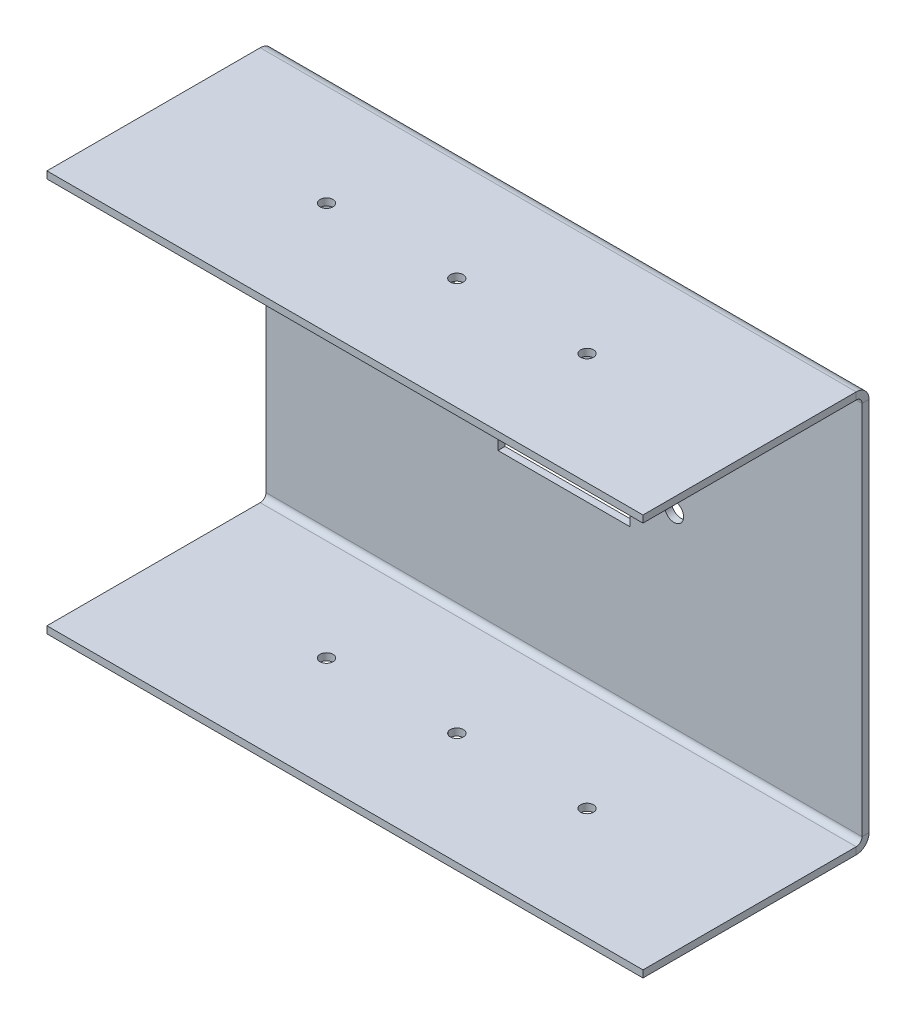
ISO-10303-21;
HEADER;
FILE_DESCRIPTION(('STEP AP214'),'2;1');
FILE_NAME('part.step','',(''),(''),'','','');
FILE_SCHEMA(('AUTOMOTIVE_DESIGN { 1 0 10303 214 1 1 1 1 }'));
ENDSEC;
DATA;
#1=APPLICATION_CONTEXT('core data for automotive mechanical design processes');
#2=APPLICATION_PROTOCOL_DEFINITION('international standard','automotive_design',2000,#1);
#3=PRODUCT_CONTEXT('',#1,'mechanical');
#4=PRODUCT('Part','Part','',(#3));
#5=PRODUCT_RELATED_PRODUCT_CATEGORY('part','',(#4));
#6=PRODUCT_DEFINITION_FORMATION('','',#4);
#7=PRODUCT_DEFINITION_CONTEXT('part definition',#1,'design');
#8=PRODUCT_DEFINITION('design','',#6,#7);
#9=PRODUCT_DEFINITION_SHAPE('','',#8);
#10=(LENGTH_UNIT() NAMED_UNIT(*) SI_UNIT(.MILLI.,.METRE.));
#11=(NAMED_UNIT(*) PLANE_ANGLE_UNIT() SI_UNIT($,.RADIAN.));
#12=(NAMED_UNIT(*) SI_UNIT($,.STERADIAN.) SOLID_ANGLE_UNIT());
#13=UNCERTAINTY_MEASURE_WITH_UNIT(LENGTH_MEASURE(1.E-05),#10,'distance_accuracy_value','');
#14=(GEOMETRIC_REPRESENTATION_CONTEXT(3) GLOBAL_UNCERTAINTY_ASSIGNED_CONTEXT((#13)) GLOBAL_UNIT_ASSIGNED_CONTEXT((#10,
#11,#12)) REPRESENTATION_CONTEXT('',''));
#15=CARTESIAN_POINT('',(0.,0.,0.));
#16=DIRECTION('',(0.,0.,1.));
#17=DIRECTION('',(1.,0.,0.));
#18=AXIS2_PLACEMENT_3D('',#15,#16,#17);
#19=CARTESIAN_POINT('',(0.,138.125592566536,137.014207433465));
#20=DIRECTION('',(0.,0.,1.));
#21=DIRECTION('',(0.,-1.,0.));
#22=AXIS2_PLACEMENT_3D('',#19,#20,#21);
#23=PLANE('',#22);
#24=DIRECTION('',(-1.,0.,0.));
#25=VECTOR('',#24,1.);
#26=CARTESIAN_POINT('',(52.69,55.9405925665379,137.014207433464));
#27=LINE('',#26,#25);
#28=CARTESIAN_POINT('',(82.69,55.9405925665358,137.014207433464));
#29=VERTEX_POINT('',#28);
#30=CARTESIAN_POINT('',(52.69,55.9405925665379,137.014207433464));
#31=VERTEX_POINT('',#30);
#32=EDGE_CURVE('E327',#29,#31,#27,.T.);
#33=ORIENTED_EDGE('',*,*,#32,.T.);
#34=DIRECTION('',(0.,-1.,0.));
#35=VECTOR('',#34,1.);
#36=CARTESIAN_POINT('',(52.69,55.9405925665379,137.014207433464));
#37=LINE('',#36,#35);
#38=CARTESIAN_POINT('',(52.69,35.9405925665358,137.014207433464));
#39=VERTEX_POINT('',#38);
#40=EDGE_CURVE('E317',#31,#39,#37,.T.);
#41=ORIENTED_EDGE('',*,*,#40,.T.);
#42=DIRECTION('',(1.,0.,0.));
#43=VECTOR('',#42,1.);
#44=CARTESIAN_POINT('',(52.69,35.9405925665358,137.014207433464));
#45=LINE('',#44,#43);
#46=CARTESIAN_POINT('',(82.69,35.9405925665358,137.014207433464));
#47=VERTEX_POINT('',#46);
#48=EDGE_CURVE('E320',#39,#47,#45,.T.);
#49=ORIENTED_EDGE('',*,*,#48,.T.);
#50=DIRECTION('',(0.,1.,0.));
#51=VECTOR('',#50,1.);
#52=CARTESIAN_POINT('',(82.69,55.9405925665358,137.014207433464));
#53=LINE('',#52,#51);
#54=EDGE_CURVE('E324',#47,#29,#53,.T.);
#55=ORIENTED_EDGE('',*,*,#54,.T.);
#56=EDGE_LOOP('',(#33,#41,#49,#55));
#57=FACE_BOUND('',#56,.T.);
#58=CARTESIAN_POINT('',(42.69,43.9405925665358,137.014207433464));
#59=DIRECTION('',(0.,0.,1.));
#60=DIRECTION('',(0.,-1.,0.));
#61=AXIS2_PLACEMENT_3D('',#58,#59,#60);
#62=CIRCLE('',#61,2.15500000000003);
#63=CARTESIAN_POINT('',(42.69,41.7855925665358,137.014207433464));
#64=VERTEX_POINT('',#63);
#65=EDGE_CURVE('E311',#64,#64,#62,.T.);
#66=ORIENTED_EDGE('',*,*,#65,.T.);
#67=EDGE_LOOP('',(#66));
#68=FACE_BOUND('',#67,.T.);
#69=CARTESIAN_POINT('',(92.69,43.9405925665358,137.014207433464));
#70=DIRECTION('',(0.,0.,1.));
#71=DIRECTION('',(0.,-1.,0.));
#72=AXIS2_PLACEMENT_3D('',#69,#70,#71);
#73=CIRCLE('',#72,2.15500000000001);
#74=CARTESIAN_POINT('',(92.69,41.7855925665358,137.014207433464));
#75=VERTEX_POINT('',#74);
#76=EDGE_CURVE('E305',#75,#75,#73,.T.);
#77=ORIENTED_EDGE('',*,*,#76,.T.);
#78=EDGE_LOOP('',(#77));
#79=FACE_BOUND('',#78,.T.);
#80=CARTESIAN_POINT('',(42.69,63.9405925665379,137.014207433464));
#81=DIRECTION('',(0.,0.,1.));
#82=DIRECTION('',(0.,-1.,0.));
#83=AXIS2_PLACEMENT_3D('',#80,#81,#82);
#84=CIRCLE('',#83,2.15500000000002);
#85=CARTESIAN_POINT('',(42.69,61.7855925665379,137.014207433464));
#86=VERTEX_POINT('',#85);
#87=EDGE_CURVE('E299',#86,#86,#84,.T.);
#88=ORIENTED_EDGE('',*,*,#87,.T.);
#89=EDGE_LOOP('',(#88));
#90=FACE_BOUND('',#89,.T.);
#91=CARTESIAN_POINT('',(92.69,63.9405925665379,137.014207433464));
#92=DIRECTION('',(0.,0.,1.));
#93=DIRECTION('',(0.,-1.,0.));
#94=AXIS2_PLACEMENT_3D('',#91,#92,#93);
#95=CIRCLE('',#94,2.15500000000001);
#96=CARTESIAN_POINT('',(92.69,61.7855925665379,137.014207433464));
#97=VERTEX_POINT('',#96);
#98=EDGE_CURVE('E293',#97,#97,#95,.T.);
#99=ORIENTED_EDGE('',*,*,#98,.T.);
#100=EDGE_LOOP('',(#99));
#101=FACE_BOUND('',#100,.T.);
#102=DIRECTION('',(0.,1.,0.));
#103=VECTOR('',#102,1.);
#104=CARTESIAN_POINT('',(135.38,138.125592566536,137.014207433465));
#105=LINE('',#104,#103);
#106=CARTESIAN_POINT('',(135.38,1.32080000000001,137.014207433464));
#107=VERTEX_POINT('',#106);
#108=CARTESIAN_POINT('',(135.38,86.5603851330717,137.014207433464));
#109=VERTEX_POINT('',#108);
#110=EDGE_CURVE('E55',#107,#109,#105,.T.);
#111=ORIENTED_EDGE('',*,*,#110,.F.);
#112=DIRECTION('',(-1.,0.,0.));
#113=VECTOR('',#112,1.);
#114=CARTESIAN_POINT('',(0.,1.32080000000001,137.014207433464));
#115=LINE('',#114,#113);
#116=CARTESIAN_POINT('',(0.,1.32080000000002,137.014207433464));
#117=VERTEX_POINT('',#116);
#118=EDGE_CURVE('E191',#107,#117,#115,.T.);
#119=ORIENTED_EDGE('',*,*,#118,.T.);
#120=DIRECTION('',(0.,-1.,0.));
#121=VECTOR('',#120,1.);
#122=CARTESIAN_POINT('',(0.,138.125592566536,137.014207433465));
#123=LINE('',#122,#121);
#124=CARTESIAN_POINT('',(0.,86.5603851330716,137.014207433464));
#125=VERTEX_POINT('',#124);
#126=EDGE_CURVE('E362',#125,#117,#123,.T.);
#127=ORIENTED_EDGE('',*,*,#126,.F.);
#128=DIRECTION('',(-1.,0.,0.));
#129=VECTOR('',#128,1.);
#130=CARTESIAN_POINT('',(0.,86.5603851330717,137.014207433464));
#131=LINE('',#130,#129);
#132=EDGE_CURVE('E348',#109,#125,#131,.T.);
#133=ORIENTED_EDGE('',*,*,#132,.F.);
#134=EDGE_LOOP('',(#111,#119,#127,#133));
#135=FACE_BOUND('',#134,.T.);
#136=ADVANCED_FACE('F51',(#57,#68,#79,#90,#101,#135),#23,.F.);
#137=CARTESIAN_POINT('',(0.,138.125592566536,137.014207433465));
#138=DIRECTION('',(-1.,0.,0.));
#139=DIRECTION('',(0.,-1.,0.));
#140=AXIS2_PLACEMENT_3D('',#137,#138,#139);
#141=PLANE('',#140);
#142=DIRECTION('',(0.,0.,-1.));
#143=VECTOR('',#142,1.);
#144=CARTESIAN_POINT('',(0.,1.32080000000001,137.014207433464));
#145=LINE('',#144,#143);
#146=CARTESIAN_POINT('',(0.,1.32080000000001,138.614407433464));
#147=VERTEX_POINT('',#146);
#148=EDGE_CURVE('E12',#147,#117,#145,.T.);
#149=ORIENTED_EDGE('',*,*,#148,.F.);
#150=DIRECTION('',(0.,-1.,0.));
#151=VECTOR('',#150,1.);
#152=CARTESIAN_POINT('',(0.,138.125592566536,138.614407433465));
#153=LINE('',#152,#151);
#154=CARTESIAN_POINT('',(0.,86.5603851330716,138.614407433464));
#155=VERTEX_POINT('',#154);
#156=EDGE_CURVE('E68',#155,#147,#153,.T.);
#157=ORIENTED_EDGE('',*,*,#156,.F.);
#158=DIRECTION('',(0.,0.,-1.));
#159=VECTOR('',#158,1.);
#160=CARTESIAN_POINT('',(0.,86.5603851330717,137.014207433464));
#161=LINE('',#160,#159);
#162=EDGE_CURVE('E350',#155,#125,#161,.T.);
#163=ORIENTED_EDGE('',*,*,#162,.T.);
#164=ORIENTED_EDGE('',*,*,#126,.T.);
#165=EDGE_LOOP('',(#149,#157,#163,#164));
#166=FACE_BOUND('',#165,.T.);
#167=ADVANCED_FACE('F53',(#166),#141,.T.);
#168=CARTESIAN_POINT('',(135.38,138.125592566536,137.014207433465));
#169=DIRECTION('',(1.,0.,0.));
#170=DIRECTION('',(0.,1.,0.));
#171=AXIS2_PLACEMENT_3D('',#168,#169,#170);
#172=PLANE('',#171);
#173=DIRECTION('',(0.,0.,1.));
#174=VECTOR('',#173,1.);
#175=CARTESIAN_POINT('',(135.38,1.32080000000001,137.014207433464));
#176=LINE('',#175,#174);
#177=CARTESIAN_POINT('',(135.38,1.32080000000001,138.614407433464));
#178=VERTEX_POINT('',#177);
#179=EDGE_CURVE('E358',#107,#178,#176,.T.);
#180=ORIENTED_EDGE('',*,*,#179,.F.);
#181=ORIENTED_EDGE('',*,*,#110,.T.);
#182=DIRECTION('',(0.,0.,1.));
#183=VECTOR('',#182,1.);
#184=CARTESIAN_POINT('',(135.38,86.5603851330716,137.014207433464));
#185=LINE('',#184,#183);
#186=CARTESIAN_POINT('',(135.38,86.5603851330716,138.614407433464));
#187=VERTEX_POINT('',#186);
#188=EDGE_CURVE('E355',#109,#187,#185,.T.);
#189=ORIENTED_EDGE('',*,*,#188,.T.);
#190=DIRECTION('',(0.,1.,0.));
#191=VECTOR('',#190,1.);
#192=CARTESIAN_POINT('',(135.38,138.125592566536,138.614407433465));
#193=LINE('',#192,#191);
#194=EDGE_CURVE('E76',#178,#187,#193,.T.);
#195=ORIENTED_EDGE('',*,*,#194,.F.);
#196=EDGE_LOOP('',(#180,#181,#189,#195));
#197=FACE_BOUND('',#196,.T.);
#198=ADVANCED_FACE('F368',(#197),#172,.T.);
#199=CARTESIAN_POINT('',(0.,138.125592566536,138.614407433465));
#200=DIRECTION('',(0.,0.,1.));
#201=DIRECTION('',(0.,-1.,0.));
#202=AXIS2_PLACEMENT_3D('',#199,#200,#201);
#203=PLANE('',#202);
#204=DIRECTION('',(-1.,0.,0.));
#205=VECTOR('',#204,1.);
#206=CARTESIAN_POINT('',(0.,1.32080000000001,138.614407433464));
#207=LINE('',#206,#205);
#208=EDGE_CURVE('E60',#178,#147,#207,.T.);
#209=ORIENTED_EDGE('',*,*,#208,.F.);
#210=ORIENTED_EDGE('',*,*,#194,.T.);
#211=DIRECTION('',(-1.,0.,0.));
#212=VECTOR('',#211,1.);
#213=CARTESIAN_POINT('',(0.,86.5603851330717,138.614407433464));
#214=LINE('',#213,#212);
#215=EDGE_CURVE('E353',#187,#155,#214,.T.);
#216=ORIENTED_EDGE('',*,*,#215,.T.);
#217=ORIENTED_EDGE('',*,*,#156,.T.);
#218=EDGE_LOOP('',(#209,#210,#216,#217));
#219=FACE_BOUND('',#218,.T.);
#220=DIRECTION('',(0.,-1.,0.));
#221=VECTOR('',#220,1.);
#222=CARTESIAN_POINT('',(52.69,55.9405925665379,138.614407433464));
#223=LINE('',#222,#221);
#224=CARTESIAN_POINT('',(52.69,55.9405925665379,138.614407433464));
#225=VERTEX_POINT('',#224);
#226=CARTESIAN_POINT('',(52.69,35.9405925665358,138.614407433464));
#227=VERTEX_POINT('',#226);
#228=EDGE_CURVE('E314',#225,#227,#223,.T.);
#229=ORIENTED_EDGE('',*,*,#228,.F.);
#230=DIRECTION('',(-1.,0.,0.));
#231=VECTOR('',#230,1.);
#232=CARTESIAN_POINT('',(52.69,55.9405925665379,138.614407433464));
#233=LINE('',#232,#231);
#234=CARTESIAN_POINT('',(82.69,55.9405925665358,138.614407433464));
#235=VERTEX_POINT('',#234);
#236=EDGE_CURVE('E321',#235,#225,#233,.T.);
#237=ORIENTED_EDGE('',*,*,#236,.F.);
#238=DIRECTION('',(0.,1.,0.));
#239=VECTOR('',#238,1.);
#240=CARTESIAN_POINT('',(82.69,55.9405925665358,138.614407433464));
#241=LINE('',#240,#239);
#242=CARTESIAN_POINT('',(82.69,35.9405925665358,138.614407433464));
#243=VERTEX_POINT('',#242);
#244=EDGE_CURVE('E335',#243,#235,#241,.T.);
#245=ORIENTED_EDGE('',*,*,#244,.F.);
#246=DIRECTION('',(1.,0.,0.));
#247=VECTOR('',#246,1.);
#248=CARTESIAN_POINT('',(52.69,35.9405925665358,138.614407433464));
#249=LINE('',#248,#247);
#250=EDGE_CURVE('E332',#227,#243,#249,.T.);
#251=ORIENTED_EDGE('',*,*,#250,.F.);
#252=EDGE_LOOP('',(#229,#237,#245,#251));
#253=FACE_BOUND('',#252,.T.);
#254=CARTESIAN_POINT('',(42.69,43.9405925665358,138.614407433464));
#255=DIRECTION('',(0.,0.,1.));
#256=DIRECTION('',(0.,-1.,0.));
#257=AXIS2_PLACEMENT_3D('',#254,#255,#256);
#258=CIRCLE('',#257,2.15500000000003);
#259=CARTESIAN_POINT('',(42.69,41.7855925665358,138.614407433464));
#260=VERTEX_POINT('',#259);
#261=EDGE_CURVE('E308',#260,#260,#258,.T.);
#262=ORIENTED_EDGE('',*,*,#261,.F.);
#263=EDGE_LOOP('',(#262));
#264=FACE_BOUND('',#263,.T.);
#265=CARTESIAN_POINT('',(92.69,43.9405925665358,138.614407433464));
#266=DIRECTION('',(0.,0.,1.));
#267=DIRECTION('',(0.,-1.,0.));
#268=AXIS2_PLACEMENT_3D('',#265,#266,#267);
#269=CIRCLE('',#268,2.15500000000001);
#270=CARTESIAN_POINT('',(92.69,41.7855925665358,138.614407433464));
#271=VERTEX_POINT('',#270);
#272=EDGE_CURVE('E302',#271,#271,#269,.T.);
#273=ORIENTED_EDGE('',*,*,#272,.F.);
#274=EDGE_LOOP('',(#273));
#275=FACE_BOUND('',#274,.T.);
#276=CARTESIAN_POINT('',(42.69,63.9405925665379,138.614407433464));
#277=DIRECTION('',(0.,0.,1.));
#278=DIRECTION('',(0.,-1.,0.));
#279=AXIS2_PLACEMENT_3D('',#276,#277,#278);
#280=CIRCLE('',#279,2.15500000000002);
#281=CARTESIAN_POINT('',(42.69,61.7855925665379,138.614407433464));
#282=VERTEX_POINT('',#281);
#283=EDGE_CURVE('E296',#282,#282,#280,.T.);
#284=ORIENTED_EDGE('',*,*,#283,.F.);
#285=EDGE_LOOP('',(#284));
#286=FACE_BOUND('',#285,.T.);
#287=CARTESIAN_POINT('',(92.69,63.9405925665379,138.614407433464));
#288=DIRECTION('',(0.,0.,1.));
#289=DIRECTION('',(0.,-1.,0.));
#290=AXIS2_PLACEMENT_3D('',#287,#288,#289);
#291=CIRCLE('',#290,2.15500000000001);
#292=CARTESIAN_POINT('',(92.69,61.7855925665379,138.614407433464));
#293=VERTEX_POINT('',#292);
#294=EDGE_CURVE('E289',#293,#293,#291,.T.);
#295=ORIENTED_EDGE('',*,*,#294,.F.);
#296=EDGE_LOOP('',(#295));
#297=FACE_BOUND('',#296,.T.);
#298=ADVANCED_FACE('F364',(#219,#253,#264,#275,#286,#297),#203,.T.);
#299=CARTESIAN_POINT('',(52.69,55.9405925665379,137.014207433464));
#300=DIRECTION('',(-1.,0.,0.));
#301=DIRECTION('',(0.,-1.,0.));
#302=AXIS2_PLACEMENT_3D('',#299,#300,#301);
#303=PLANE('',#302);
#304=ORIENTED_EDGE('',*,*,#228,.T.);
#305=DIRECTION('',(0.,0.,1.));
#306=VECTOR('',#305,1.);
#307=CARTESIAN_POINT('',(52.69,35.9405925665358,137.014207433464));
#308=LINE('',#307,#306);
#309=EDGE_CURVE('E330',#39,#227,#308,.T.);
#310=ORIENTED_EDGE('',*,*,#309,.F.);
#311=ORIENTED_EDGE('',*,*,#40,.F.);
#312=DIRECTION('',(0.,0.,1.));
#313=VECTOR('',#312,1.);
#314=CARTESIAN_POINT('',(52.69,55.9405925665379,137.014207433464));
#315=LINE('',#314,#313);
#316=EDGE_CURVE('E340',#31,#225,#315,.T.);
#317=ORIENTED_EDGE('',*,*,#316,.T.);
#318=EDGE_LOOP('',(#304,#310,#311,#317));
#319=FACE_BOUND('',#318,.T.);
#320=ADVANCED_FACE('F452',(#319),#303,.F.);
#321=CARTESIAN_POINT('',(52.69,55.9405925665379,137.014207433464));
#322=DIRECTION('',(0.,1.,0.));
#323=DIRECTION('',(-1.,0.,0.));
#324=AXIS2_PLACEMENT_3D('',#321,#322,#323);
#325=PLANE('',#324);
#326=ORIENTED_EDGE('',*,*,#236,.T.);
#327=ORIENTED_EDGE('',*,*,#316,.F.);
#328=ORIENTED_EDGE('',*,*,#32,.F.);
#329=DIRECTION('',(0.,0.,1.));
#330=VECTOR('',#329,1.);
#331=CARTESIAN_POINT('',(82.69,55.9405925665358,137.014207433464));
#332=LINE('',#331,#330);
#333=EDGE_CURVE('E342',#29,#235,#332,.T.);
#334=ORIENTED_EDGE('',*,*,#333,.T.);
#335=EDGE_LOOP('',(#326,#327,#328,#334));
#336=FACE_BOUND('',#335,.T.);
#337=ADVANCED_FACE('F459',(#336),#325,.F.);
#338=CARTESIAN_POINT('',(82.69,55.9405925665358,137.014207433464));
#339=DIRECTION('',(1.,0.,0.));
#340=DIRECTION('',(0.,1.,0.));
#341=AXIS2_PLACEMENT_3D('',#338,#339,#340);
#342=PLANE('',#341);
#343=ORIENTED_EDGE('',*,*,#244,.T.);
#344=ORIENTED_EDGE('',*,*,#333,.F.);
#345=ORIENTED_EDGE('',*,*,#54,.F.);
#346=DIRECTION('',(0.,0.,1.));
#347=VECTOR('',#346,1.);
#348=CARTESIAN_POINT('',(82.69,35.9405925665358,137.014207433464));
#349=LINE('',#348,#347);
#350=EDGE_CURVE('E344',#47,#243,#349,.T.);
#351=ORIENTED_EDGE('',*,*,#350,.T.);
#352=EDGE_LOOP('',(#343,#344,#345,#351));
#353=FACE_BOUND('',#352,.T.);
#354=ADVANCED_FACE('F464',(#353),#342,.F.);
#355=CARTESIAN_POINT('',(52.69,35.9405925665358,137.014207433464));
#356=DIRECTION('',(0.,-1.,0.));
#357=DIRECTION('',(1.,0.,0.));
#358=AXIS2_PLACEMENT_3D('',#355,#356,#357);
#359=PLANE('',#358);
#360=ORIENTED_EDGE('',*,*,#250,.T.);
#361=ORIENTED_EDGE('',*,*,#350,.F.);
#362=ORIENTED_EDGE('',*,*,#48,.F.);
#363=ORIENTED_EDGE('',*,*,#309,.T.);
#364=EDGE_LOOP('',(#360,#361,#362,#363));
#365=FACE_BOUND('',#364,.T.);
#366=ADVANCED_FACE('F473',(#365),#359,.F.);
#367=CARTESIAN_POINT('',(42.69,43.9405925665358,137.014207433464));
#368=DIRECTION('',(0.,0.,1.));
#369=DIRECTION('',(0.,-1.,0.));
#370=AXIS2_PLACEMENT_3D('',#367,#368,#369);
#371=CYLINDRICAL_SURFACE('',#370,2.15500000000003);
#372=ORIENTED_EDGE('',*,*,#65,.F.);
#373=EDGE_LOOP('',(#372));
#374=FACE_BOUND('',#373,.T.);
#375=ORIENTED_EDGE('',*,*,#261,.T.);
#376=EDGE_LOOP('',(#375));
#377=FACE_BOUND('',#376,.T.);
#378=ADVANCED_FACE('F484',(#374,#377),#371,.F.);
#379=CARTESIAN_POINT('',(92.69,43.9405925665358,137.014207433464));
#380=DIRECTION('',(0.,0.,1.));
#381=DIRECTION('',(0.,-1.,0.));
#382=AXIS2_PLACEMENT_3D('',#379,#380,#381);
#383=CYLINDRICAL_SURFACE('',#382,2.15500000000001);
#384=ORIENTED_EDGE('',*,*,#76,.F.);
#385=EDGE_LOOP('',(#384));
#386=FACE_BOUND('',#385,.T.);
#387=ORIENTED_EDGE('',*,*,#272,.T.);
#388=EDGE_LOOP('',(#387));
#389=FACE_BOUND('',#388,.T.);
#390=ADVANCED_FACE('F488',(#386,#389),#383,.F.);
#391=CARTESIAN_POINT('',(42.69,63.9405925665379,137.014207433464));
#392=DIRECTION('',(0.,0.,1.));
#393=DIRECTION('',(0.,-1.,0.));
#394=AXIS2_PLACEMENT_3D('',#391,#392,#393);
#395=CYLINDRICAL_SURFACE('',#394,2.15500000000002);
#396=ORIENTED_EDGE('',*,*,#87,.F.);
#397=EDGE_LOOP('',(#396));
#398=FACE_BOUND('',#397,.T.);
#399=ORIENTED_EDGE('',*,*,#283,.T.);
#400=EDGE_LOOP('',(#399));
#401=FACE_BOUND('',#400,.T.);
#402=ADVANCED_FACE('F492',(#398,#401),#395,.F.);
#403=CARTESIAN_POINT('',(92.69,63.9405925665379,137.014207433464));
#404=DIRECTION('',(0.,0.,1.));
#405=DIRECTION('',(0.,-1.,0.));
#406=AXIS2_PLACEMENT_3D('',#403,#404,#405);
#407=CYLINDRICAL_SURFACE('',#406,2.15500000000001);
#408=ORIENTED_EDGE('',*,*,#98,.F.);
#409=EDGE_LOOP('',(#408));
#410=FACE_BOUND('',#409,.T.);
#411=ORIENTED_EDGE('',*,*,#294,.T.);
#412=EDGE_LOOP('',(#411));
#413=FACE_BOUND('',#412,.T.);
#414=ADVANCED_FACE('F496',(#410,#413),#407,.F.);
#415=CARTESIAN_POINT('',(135.38,86.5603851330716,139.935207433464));
#416=DIRECTION('',(1.,0.,0.));
#417=DIRECTION('',(0.,1.,0.));
#418=AXIS2_PLACEMENT_3D('',#415,#416,#417);
#419=PLANE('',#418);
#420=DIRECTION('',(0.,-1.,0.));
#421=VECTOR('',#420,1.);
#422=CARTESIAN_POINT('',(135.38,89.4813851330717,139.935207433464));
#423=LINE('',#422,#421);
#424=CARTESIAN_POINT('',(135.38,89.4813851330717,139.935207433464));
#425=VERTEX_POINT('',#424);
#426=CARTESIAN_POINT('',(135.38,87.8811851330717,139.935207433464));
#427=VERTEX_POINT('',#426);
#428=EDGE_CURVE('E278',#425,#427,#423,.T.);
#429=ORIENTED_EDGE('',*,*,#428,.T.);
#430=CARTESIAN_POINT('',(135.38,86.5603851330716,139.935207433464));
#431=DIRECTION('',(1.,0.,0.));
#432=DIRECTION('',(0.,1.,0.));
#433=AXIS2_PLACEMENT_3D('',#430,#431,#432);
#434=CIRCLE('',#433,1.3208);
#435=EDGE_CURVE('E234',#427,#187,#434,.F.);
#436=ORIENTED_EDGE('',*,*,#435,.T.);
#437=ORIENTED_EDGE('',*,*,#188,.F.);
#438=CARTESIAN_POINT('',(135.38,86.5603851330716,139.935207433464));
#439=DIRECTION('',(-1.,0.,0.));
#440=DIRECTION('',(0.,1.,0.));
#441=AXIS2_PLACEMENT_3D('',#438,#439,#440);
#442=CIRCLE('',#441,2.921);
#443=EDGE_CURVE('E282',#425,#109,#442,.T.);
#444=ORIENTED_EDGE('',*,*,#443,.F.);
#445=EDGE_LOOP('',(#429,#436,#437,#444));
#446=FACE_BOUND('',#445,.T.);
#447=ADVANCED_FACE('F372',(#446),#419,.T.);
#448=CARTESIAN_POINT('',(0.,86.5603851330716,139.935207433464));
#449=DIRECTION('',(-1.,0.,0.));
#450=DIRECTION('',(0.,-1.,0.));
#451=AXIS2_PLACEMENT_3D('',#448,#449,#450);
#452=PLANE('',#451);
#453=ORIENTED_EDGE('',*,*,#162,.F.);
#454=CARTESIAN_POINT('',(0.,86.5603851330716,139.935207433464));
#455=DIRECTION('',(1.,0.,0.));
#456=DIRECTION('',(0.,1.,0.));
#457=AXIS2_PLACEMENT_3D('',#454,#455,#456);
#458=CIRCLE('',#457,1.3208);
#459=CARTESIAN_POINT('',(0.,87.8811851330717,139.935207433464));
#460=VERTEX_POINT('',#459);
#461=EDGE_CURVE('E286',#155,#460,#458,.T.);
#462=ORIENTED_EDGE('',*,*,#461,.T.);
#463=DIRECTION('',(0.,1.,0.));
#464=VECTOR('',#463,1.);
#465=CARTESIAN_POINT('',(0.,89.4813851330717,139.935207433464));
#466=LINE('',#465,#464);
#467=CARTESIAN_POINT('',(0.,89.4813851330717,139.935207433464));
#468=VERTEX_POINT('',#467);
#469=EDGE_CURVE('E272',#460,#468,#466,.T.);
#470=ORIENTED_EDGE('',*,*,#469,.T.);
#471=CARTESIAN_POINT('',(0.,86.5603851330716,139.935207433464));
#472=DIRECTION('',(1.,0.,0.));
#473=DIRECTION('',(0.,-1.,0.));
#474=AXIS2_PLACEMENT_3D('',#471,#472,#473);
#475=CIRCLE('',#474,2.921);
#476=EDGE_CURVE('E285',#125,#468,#475,.T.);
#477=ORIENTED_EDGE('',*,*,#476,.F.);
#478=EDGE_LOOP('',(#453,#462,#470,#477));
#479=FACE_BOUND('',#478,.T.);
#480=ADVANCED_FACE('F385',(#479),#452,.T.);
#481=CARTESIAN_POINT('',(-67.7356420966099,86.5603851330717,139.935207433464));
#482=DIRECTION('',(1.,0.,0.));
#483=DIRECTION('',(0.,1.,0.));
#484=AXIS2_PLACEMENT_3D('',#481,#482,#483);
#485=CYLINDRICAL_SURFACE('',#484,2.921);
#486=ORIENTED_EDGE('',*,*,#476,.T.);
#487=DIRECTION('',(-1.,0.,0.));
#488=VECTOR('',#487,1.);
#489=CARTESIAN_POINT('',(0.,89.4813851330717,139.935207433464));
#490=LINE('',#489,#488);
#491=EDGE_CURVE('E246',#425,#468,#490,.T.);
#492=ORIENTED_EDGE('',*,*,#491,.F.);
#493=ORIENTED_EDGE('',*,*,#443,.T.);
#494=ORIENTED_EDGE('',*,*,#132,.T.);
#495=EDGE_LOOP('',(#486,#492,#493,#494));
#496=FACE_BOUND('',#495,.T.);
#497=ADVANCED_FACE('F376',(#496),#485,.T.);
#498=CARTESIAN_POINT('',(-67.7356420966099,86.5603851330717,139.935207433464));
#499=DIRECTION('',(1.,0.,0.));
#500=DIRECTION('',(0.,1.,0.));
#501=AXIS2_PLACEMENT_3D('',#498,#499,#500);
#502=CYLINDRICAL_SURFACE('',#501,1.3208);
#503=ORIENTED_EDGE('',*,*,#461,.F.);
#504=ORIENTED_EDGE('',*,*,#215,.F.);
#505=ORIENTED_EDGE('',*,*,#435,.F.);
#506=DIRECTION('',(-1.,0.,0.));
#507=VECTOR('',#506,1.);
#508=CARTESIAN_POINT('',(0.,87.8811851330717,139.935207433464));
#509=LINE('',#508,#507);
#510=EDGE_CURVE('E275',#427,#460,#509,.T.);
#511=ORIENTED_EDGE('',*,*,#510,.T.);
#512=EDGE_LOOP('',(#503,#504,#505,#511));
#513=FACE_BOUND('',#512,.T.);
#514=ADVANCED_FACE('F399',(#513),#502,.F.);
#515=CARTESIAN_POINT('',(0.,89.4813851330713,188.37));
#516=DIRECTION('',(0.,0.,1.));
#517=DIRECTION('',(-1.,0.,0.));
#518=AXIS2_PLACEMENT_3D('',#515,#516,#517);
#519=PLANE('',#518);
#520=DIRECTION('',(-1.,0.,0.));
#521=VECTOR('',#520,1.);
#522=CARTESIAN_POINT('',(0.,87.8811851330713,188.37));
#523=LINE('',#522,#521);
#524=CARTESIAN_POINT('',(135.38,87.8811851330713,188.37));
#525=VERTEX_POINT('',#524);
#526=CARTESIAN_POINT('',(0.,87.8811851330713,188.37));
#527=VERTEX_POINT('',#526);
#528=EDGE_CURVE('E239',#525,#527,#523,.T.);
#529=ORIENTED_EDGE('',*,*,#528,.F.);
#530=DIRECTION('',(0.,-1.,0.));
#531=VECTOR('',#530,1.);
#532=CARTESIAN_POINT('',(135.38,89.4813851330713,188.37));
#533=LINE('',#532,#531);
#534=CARTESIAN_POINT('',(135.38,89.4813851330713,188.37));
#535=VERTEX_POINT('',#534);
#536=EDGE_CURVE('E231',#535,#525,#533,.T.);
#537=ORIENTED_EDGE('',*,*,#536,.F.);
#538=DIRECTION('',(-1.,0.,0.));
#539=VECTOR('',#538,1.);
#540=CARTESIAN_POINT('',(0.,89.4813851330713,188.37));
#541=LINE('',#540,#539);
#542=CARTESIAN_POINT('',(0.,89.4813851330713,188.37));
#543=VERTEX_POINT('',#542);
#544=EDGE_CURVE('E269',#535,#543,#541,.T.);
#545=ORIENTED_EDGE('',*,*,#544,.T.);
#546=DIRECTION('',(0.,-1.,0.));
#547=VECTOR('',#546,1.);
#548=CARTESIAN_POINT('',(0.,89.4813851330713,188.37));
#549=LINE('',#548,#547);
#550=EDGE_CURVE('E267',#543,#527,#549,.T.);
#551=ORIENTED_EDGE('',*,*,#550,.T.);
#552=EDGE_LOOP('',(#529,#537,#545,#551));
#553=FACE_BOUND('',#552,.T.);
#554=ADVANCED_FACE('F393',(#553),#519,.T.);
#555=CARTESIAN_POINT('',(67.69,89.4813851330715,162.97));
#556=DIRECTION('',(0.,-1.,0.));
#557=DIRECTION('',(0.,0.,-1.));
#558=AXIS2_PLACEMENT_3D('',#555,#556,#557);
#559=CYLINDRICAL_SURFACE('',#558,1.4732);
#560=CARTESIAN_POINT('',(67.69,89.4813851330715,162.97));
#561=DIRECTION('',(0.,-1.,0.));
#562=DIRECTION('',(0.,0.,-1.));
#563=AXIS2_PLACEMENT_3D('',#560,#561,#562);
#564=CIRCLE('',#563,1.4732);
#565=CARTESIAN_POINT('',(67.69,89.4813851330715,161.4968));
#566=VERTEX_POINT('',#565);
#567=EDGE_CURVE('E249',#566,#566,#564,.T.);
#568=ORIENTED_EDGE('',*,*,#567,.F.);
#569=EDGE_LOOP('',(#568));
#570=FACE_BOUND('',#569,.T.);
#571=CARTESIAN_POINT('',(67.69,87.8811851330715,162.97));
#572=DIRECTION('',(0.,-1.,0.));
#573=DIRECTION('',(0.,0.,-1.));
#574=AXIS2_PLACEMENT_3D('',#571,#572,#573);
#575=CIRCLE('',#574,1.4732);
#576=CARTESIAN_POINT('',(67.69,87.8811851330715,161.4968));
#577=VERTEX_POINT('',#576);
#578=EDGE_CURVE('E264',#577,#577,#575,.T.);
#579=ORIENTED_EDGE('',*,*,#578,.T.);
#580=EDGE_LOOP('',(#579));
#581=FACE_BOUND('',#580,.T.);
#582=ADVANCED_FACE('F528',(#570,#581),#559,.F.);
#583=CARTESIAN_POINT('',(97.28,89.4813851330715,162.97));
#584=DIRECTION('',(0.,-1.,0.));
#585=DIRECTION('',(0.,0.,-1.));
#586=AXIS2_PLACEMENT_3D('',#583,#584,#585);
#587=CYLINDRICAL_SURFACE('',#586,1.4732);
#588=CARTESIAN_POINT('',(97.28,89.4813851330715,162.97));
#589=DIRECTION('',(0.,-1.,0.));
#590=DIRECTION('',(0.,0.,-1.));
#591=AXIS2_PLACEMENT_3D('',#588,#589,#590);
#592=CIRCLE('',#591,1.4732);
#593=CARTESIAN_POINT('',(97.28,89.4813851330715,161.4968));
#594=VERTEX_POINT('',#593);
#595=EDGE_CURVE('E252',#594,#594,#592,.T.);
#596=ORIENTED_EDGE('',*,*,#595,.F.);
#597=EDGE_LOOP('',(#596));
#598=FACE_BOUND('',#597,.T.);
#599=CARTESIAN_POINT('',(97.28,87.8811851330715,162.97));
#600=DIRECTION('',(0.,-1.,0.));
#601=DIRECTION('',(0.,0.,-1.));
#602=AXIS2_PLACEMENT_3D('',#599,#600,#601);
#603=CIRCLE('',#602,1.4732);
#604=CARTESIAN_POINT('',(97.28,87.8811851330715,161.4968));
#605=VERTEX_POINT('',#604);
#606=EDGE_CURVE('E261',#605,#605,#603,.T.);
#607=ORIENTED_EDGE('',*,*,#606,.T.);
#608=EDGE_LOOP('',(#607));
#609=FACE_BOUND('',#608,.T.);
#610=ADVANCED_FACE('F524',(#598,#609),#587,.F.);
#611=CARTESIAN_POINT('',(38.1,89.4813851330715,162.97));
#612=DIRECTION('',(0.,-1.,0.));
#613=DIRECTION('',(0.,0.,-1.));
#614=AXIS2_PLACEMENT_3D('',#611,#612,#613);
#615=CYLINDRICAL_SURFACE('',#614,1.4732);
#616=CARTESIAN_POINT('',(38.1,89.4813851330715,162.97));
#617=DIRECTION('',(0.,-1.,0.));
#618=DIRECTION('',(0.,0.,-1.));
#619=AXIS2_PLACEMENT_3D('',#616,#617,#618);
#620=CIRCLE('',#619,1.4732);
#621=CARTESIAN_POINT('',(38.1,89.4813851330715,161.4968));
#622=VERTEX_POINT('',#621);
#623=EDGE_CURVE('E255',#622,#622,#620,.T.);
#624=ORIENTED_EDGE('',*,*,#623,.F.);
#625=EDGE_LOOP('',(#624));
#626=FACE_BOUND('',#625,.T.);
#627=CARTESIAN_POINT('',(38.1,87.8811851330715,162.97));
#628=DIRECTION('',(0.,-1.,0.));
#629=DIRECTION('',(0.,0.,-1.));
#630=AXIS2_PLACEMENT_3D('',#627,#628,#629);
#631=CIRCLE('',#630,1.4732);
#632=CARTESIAN_POINT('',(38.1,87.8811851330715,161.4968));
#633=VERTEX_POINT('',#632);
#634=EDGE_CURVE('E258',#633,#633,#631,.T.);
#635=ORIENTED_EDGE('',*,*,#634,.T.);
#636=EDGE_LOOP('',(#635));
#637=FACE_BOUND('',#636,.T.);
#638=ADVANCED_FACE('F520',(#626,#637),#615,.F.);
#639=CARTESIAN_POINT('',(0.,89.4813851330713,188.37));
#640=DIRECTION('',(0.,-1.,0.));
#641=DIRECTION('',(0.,0.,-1.));
#642=AXIS2_PLACEMENT_3D('',#639,#640,#641);
#643=PLANE('',#642);
#644=ORIENTED_EDGE('',*,*,#623,.T.);
#645=EDGE_LOOP('',(#644));
#646=FACE_BOUND('',#645,.T.);
#647=ORIENTED_EDGE('',*,*,#595,.T.);
#648=EDGE_LOOP('',(#647));
#649=FACE_BOUND('',#648,.T.);
#650=ORIENTED_EDGE('',*,*,#567,.T.);
#651=EDGE_LOOP('',(#650));
#652=FACE_BOUND('',#651,.T.);
#653=DIRECTION('',(0.,0.,1.));
#654=VECTOR('',#653,1.);
#655=CARTESIAN_POINT('',(135.38,89.4813851330713,188.37));
#656=LINE('',#655,#654);
#657=EDGE_CURVE('E235',#425,#535,#656,.T.);
#658=ORIENTED_EDGE('',*,*,#657,.F.);
#659=ORIENTED_EDGE('',*,*,#491,.T.);
#660=DIRECTION('',(0.,0.,-1.));
#661=VECTOR('',#660,1.);
#662=CARTESIAN_POINT('',(0.,89.4813851330713,188.37));
#663=LINE('',#662,#661);
#664=EDGE_CURVE('E244',#543,#468,#663,.T.);
#665=ORIENTED_EDGE('',*,*,#664,.F.);
#666=ORIENTED_EDGE('',*,*,#544,.F.);
#667=EDGE_LOOP('',(#658,#659,#665,#666));
#668=FACE_BOUND('',#667,.T.);
#669=ADVANCED_FACE('F380',(#646,#649,#652,#668),#643,.F.);
#670=CARTESIAN_POINT('',(0.,89.4813851330713,188.37));
#671=DIRECTION('',(-1.,0.,0.));
#672=DIRECTION('',(0.,0.,-1.));
#673=AXIS2_PLACEMENT_3D('',#670,#671,#672);
#674=PLANE('',#673);
#675=ORIENTED_EDGE('',*,*,#469,.F.);
#676=DIRECTION('',(0.,0.,-1.));
#677=VECTOR('',#676,1.);
#678=CARTESIAN_POINT('',(0.,87.8811851330713,188.37));
#679=LINE('',#678,#677);
#680=EDGE_CURVE('E237',#527,#460,#679,.T.);
#681=ORIENTED_EDGE('',*,*,#680,.F.);
#682=ORIENTED_EDGE('',*,*,#550,.F.);
#683=ORIENTED_EDGE('',*,*,#664,.T.);
#684=EDGE_LOOP('',(#675,#681,#682,#683));
#685=FACE_BOUND('',#684,.T.);
#686=ADVANCED_FACE('F390',(#685),#674,.T.);
#687=CARTESIAN_POINT('',(0.,87.8811851330713,188.37));
#688=DIRECTION('',(0.,-1.,0.));
#689=DIRECTION('',(0.,0.,-1.));
#690=AXIS2_PLACEMENT_3D('',#687,#688,#689);
#691=PLANE('',#690);
#692=ORIENTED_EDGE('',*,*,#510,.F.);
#693=DIRECTION('',(0.,0.,1.));
#694=VECTOR('',#693,1.);
#695=CARTESIAN_POINT('',(135.38,87.8811851330713,188.37));
#696=LINE('',#695,#694);
#697=EDGE_CURVE('E242',#427,#525,#696,.T.);
#698=ORIENTED_EDGE('',*,*,#697,.T.);
#699=ORIENTED_EDGE('',*,*,#528,.T.);
#700=ORIENTED_EDGE('',*,*,#680,.T.);
#701=EDGE_LOOP('',(#692,#698,#699,#700));
#702=FACE_BOUND('',#701,.T.);
#703=ORIENTED_EDGE('',*,*,#578,.F.);
#704=EDGE_LOOP('',(#703));
#705=FACE_BOUND('',#704,.T.);
#706=ORIENTED_EDGE('',*,*,#606,.F.);
#707=EDGE_LOOP('',(#706));
#708=FACE_BOUND('',#707,.T.);
#709=ORIENTED_EDGE('',*,*,#634,.F.);
#710=EDGE_LOOP('',(#709));
#711=FACE_BOUND('',#710,.T.);
#712=ADVANCED_FACE('F512',(#702,#705,#708,#711),#691,.T.);
#713=CARTESIAN_POINT('',(135.38,89.4813851330713,188.37));
#714=DIRECTION('',(1.,0.,0.));
#715=DIRECTION('',(0.,0.,1.));
#716=AXIS2_PLACEMENT_3D('',#713,#714,#715);
#717=PLANE('',#716);
#718=ORIENTED_EDGE('',*,*,#428,.F.);
#719=ORIENTED_EDGE('',*,*,#657,.T.);
#720=ORIENTED_EDGE('',*,*,#536,.T.);
#721=ORIENTED_EDGE('',*,*,#697,.F.);
#722=EDGE_LOOP('',(#718,#719,#720,#721));
#723=FACE_BOUND('',#722,.T.);
#724=ADVANCED_FACE('F396',(#723),#717,.T.);
#725=CARTESIAN_POINT('',(97.28,-1.6002,162.97));
#726=DIRECTION('',(0.,1.,0.));
#727=DIRECTION('',(0.,0.,1.));
#728=AXIS2_PLACEMENT_3D('',#725,#726,#727);
#729=CYLINDRICAL_SURFACE('',#728,1.4732);
#730=CARTESIAN_POINT('',(97.28,-1.6002,162.97));
#731=DIRECTION('',(0.,1.,0.));
#732=DIRECTION('',(0.,0.,-1.));
#733=AXIS2_PLACEMENT_3D('',#730,#731,#732);
#734=CIRCLE('',#733,1.4732);
#735=CARTESIAN_POINT('',(97.28,-1.6002,161.4968));
#736=VERTEX_POINT('',#735);
#737=EDGE_CURVE('E208',#736,#736,#734,.T.);
#738=ORIENTED_EDGE('',*,*,#737,.F.);
#739=EDGE_LOOP('',(#738));
#740=FACE_BOUND('',#739,.T.);
#741=CARTESIAN_POINT('',(97.28,0.,162.97));
#742=DIRECTION('',(0.,1.,0.));
#743=DIRECTION('',(0.,0.,-1.));
#744=AXIS2_PLACEMENT_3D('',#741,#742,#743);
#745=CIRCLE('',#744,1.4732);
#746=CARTESIAN_POINT('',(97.28,0.,161.4968));
#747=VERTEX_POINT('',#746);
#748=EDGE_CURVE('E204',#747,#747,#745,.T.);
#749=ORIENTED_EDGE('',*,*,#748,.T.);
#750=EDGE_LOOP('',(#749));
#751=FACE_BOUND('',#750,.T.);
#752=ADVANCED_FACE('F511',(#740,#751),#729,.F.);
#753=CARTESIAN_POINT('',(38.1,-1.6002,162.97));
#754=DIRECTION('',(0.,1.,0.));
#755=DIRECTION('',(0.,0.,1.));
#756=AXIS2_PLACEMENT_3D('',#753,#754,#755);
#757=CYLINDRICAL_SURFACE('',#756,1.4732);
#758=CARTESIAN_POINT('',(38.1,-1.6002,162.97));
#759=DIRECTION('',(0.,1.,0.));
#760=DIRECTION('',(0.,0.,-1.));
#761=AXIS2_PLACEMENT_3D('',#758,#759,#760);
#762=CIRCLE('',#761,1.4732);
#763=CARTESIAN_POINT('',(38.1,-1.6002,161.4968));
#764=VERTEX_POINT('',#763);
#765=EDGE_CURVE('E211',#764,#764,#762,.T.);
#766=ORIENTED_EDGE('',*,*,#765,.F.);
#767=EDGE_LOOP('',(#766));
#768=FACE_BOUND('',#767,.T.);
#769=CARTESIAN_POINT('',(38.1,0.,162.97));
#770=DIRECTION('',(0.,1.,0.));
#771=DIRECTION('',(0.,0.,-1.));
#772=AXIS2_PLACEMENT_3D('',#769,#770,#771);
#773=CIRCLE('',#772,1.4732);
#774=CARTESIAN_POINT('',(38.1,0.,161.4968));
#775=VERTEX_POINT('',#774);
#776=EDGE_CURVE('E226',#775,#775,#773,.T.);
#777=ORIENTED_EDGE('',*,*,#776,.T.);
#778=EDGE_LOOP('',(#777));
#779=FACE_BOUND('',#778,.T.);
#780=ADVANCED_FACE('F571',(#768,#779),#757,.F.);
#781=CARTESIAN_POINT('',(67.69,-1.6002,162.97));
#782=DIRECTION('',(0.,1.,0.));
#783=DIRECTION('',(0.,0.,1.));
#784=AXIS2_PLACEMENT_3D('',#781,#782,#783);
#785=CYLINDRICAL_SURFACE('',#784,1.4732);
#786=CARTESIAN_POINT('',(67.69,-1.6002,162.97));
#787=DIRECTION('',(0.,1.,0.));
#788=DIRECTION('',(0.,0.,1.));
#789=AXIS2_PLACEMENT_3D('',#786,#787,#788);
#790=CIRCLE('',#789,1.4732);
#791=CARTESIAN_POINT('',(67.69,-1.6002,164.4432));
#792=VERTEX_POINT('',#791);
#793=EDGE_CURVE('E217',#792,#792,#790,.T.);
#794=ORIENTED_EDGE('',*,*,#793,.F.);
#795=EDGE_LOOP('',(#794));
#796=FACE_BOUND('',#795,.T.);
#797=CARTESIAN_POINT('',(67.69,0.,162.97));
#798=DIRECTION('',(0.,1.,0.));
#799=DIRECTION('',(0.,0.,1.));
#800=AXIS2_PLACEMENT_3D('',#797,#798,#799);
#801=CIRCLE('',#800,1.4732);
#802=CARTESIAN_POINT('',(67.69,0.,164.4432));
#803=VERTEX_POINT('',#802);
#804=EDGE_CURVE('E223',#803,#803,#801,.T.);
#805=ORIENTED_EDGE('',*,*,#804,.T.);
#806=EDGE_LOOP('',(#805));
#807=FACE_BOUND('',#806,.T.);
#808=ADVANCED_FACE('F579',(#796,#807),#785,.F.);
#809=CARTESIAN_POINT('',(0.,-1.6002,188.37));
#810=DIRECTION('',(0.,0.,1.));
#811=DIRECTION('',(1.,0.,0.));
#812=AXIS2_PLACEMENT_3D('',#809,#810,#811);
#813=PLANE('',#812);
#814=DIRECTION('',(1.,0.,0.));
#815=VECTOR('',#814,1.);
#816=CARTESIAN_POINT('',(0.,0.,188.37));
#817=LINE('',#816,#815);
#818=CARTESIAN_POINT('',(0.,0.,188.37));
#819=VERTEX_POINT('',#818);
#820=CARTESIAN_POINT('',(135.38,0.,188.37));
#821=VERTEX_POINT('',#820);
#822=EDGE_CURVE('E420',#819,#821,#817,.T.);
#823=ORIENTED_EDGE('',*,*,#822,.F.);
#824=DIRECTION('',(0.,1.,0.));
#825=VECTOR('',#824,1.);
#826=CARTESIAN_POINT('',(0.,-1.6002,188.37));
#827=LINE('',#826,#825);
#828=CARTESIAN_POINT('',(0.,-1.6002,188.37));
#829=VERTEX_POINT('',#828);
#830=EDGE_CURVE('E281',#829,#819,#827,.T.);
#831=ORIENTED_EDGE('',*,*,#830,.F.);
#832=DIRECTION('',(1.,0.,0.));
#833=VECTOR('',#832,1.);
#834=CARTESIAN_POINT('',(0.,-1.6002,188.37));
#835=LINE('',#834,#833);
#836=CARTESIAN_POINT('',(135.38,-1.6002,188.37));
#837=VERTEX_POINT('',#836);
#838=EDGE_CURVE('E221',#829,#837,#835,.T.);
#839=ORIENTED_EDGE('',*,*,#838,.T.);
#840=DIRECTION('',(0.,1.,0.));
#841=VECTOR('',#840,1.);
#842=CARTESIAN_POINT('',(135.38,-1.6002,188.37));
#843=LINE('',#842,#841);
#844=EDGE_CURVE('E207',#837,#821,#843,.T.);
#845=ORIENTED_EDGE('',*,*,#844,.T.);
#846=EDGE_LOOP('',(#823,#831,#839,#845));
#847=FACE_BOUND('',#846,.T.);
#848=ADVANCED_FACE('F430',(#847),#813,.T.);
#849=CARTESIAN_POINT('',(0.,-1.6002,0.));
#850=DIRECTION('',(0.,1.,0.));
#851=DIRECTION('',(0.,0.,1.));
#852=AXIS2_PLACEMENT_3D('',#849,#850,#851);
#853=PLANE('',#852);
#854=DIRECTION('',(-1.,0.,0.));
#855=VECTOR('',#854,1.);
#856=CARTESIAN_POINT('',(0.,-1.6002,139.935207433464));
#857=LINE('',#856,#855);
#858=CARTESIAN_POINT('',(135.38,-1.6002,139.935207433464));
#859=VERTEX_POINT('',#858);
#860=CARTESIAN_POINT('',(0.,-1.6002,139.935207433464));
#861=VERTEX_POINT('',#860);
#862=EDGE_CURVE('E188',#859,#861,#857,.T.);
#863=ORIENTED_EDGE('',*,*,#862,.F.);
#864=DIRECTION('',(0.,0.,-1.));
#865=VECTOR('',#864,1.);
#866=CARTESIAN_POINT('',(135.38,-1.6002,0.));
#867=LINE('',#866,#865);
#868=EDGE_CURVE('E182',#837,#859,#867,.T.);
#869=ORIENTED_EDGE('',*,*,#868,.F.);
#870=ORIENTED_EDGE('',*,*,#838,.F.);
#871=DIRECTION('',(0.,0.,1.));
#872=VECTOR('',#871,1.);
#873=CARTESIAN_POINT('',(0.,-1.6002,0.));
#874=LINE('',#873,#872);
#875=EDGE_CURVE('E202',#861,#829,#874,.T.);
#876=ORIENTED_EDGE('',*,*,#875,.F.);
#877=EDGE_LOOP('',(#863,#869,#870,#876));
#878=FACE_BOUND('',#877,.T.);
#879=ORIENTED_EDGE('',*,*,#793,.T.);
#880=EDGE_LOOP('',(#879));
#881=FACE_BOUND('',#880,.T.);
#882=ORIENTED_EDGE('',*,*,#765,.T.);
#883=EDGE_LOOP('',(#882));
#884=FACE_BOUND('',#883,.T.);
#885=ORIENTED_EDGE('',*,*,#737,.T.);
#886=EDGE_LOOP('',(#885));
#887=FACE_BOUND('',#886,.T.);
#888=ADVANCED_FACE('F198',(#878,#881,#884,#887),#853,.F.);
#889=CARTESIAN_POINT('',(135.38,-1.6002,0.));
#890=DIRECTION('',(1.,0.,0.));
#891=DIRECTION('',(0.,0.,-1.));
#892=AXIS2_PLACEMENT_3D('',#889,#890,#891);
#893=PLANE('',#892);
#894=ORIENTED_EDGE('',*,*,#868,.T.);
#895=DIRECTION('',(0.,1.,0.));
#896=VECTOR('',#895,1.);
#897=CARTESIAN_POINT('',(135.38,-1.60019999999999,139.935207433464));
#898=LINE('',#897,#896);
#899=CARTESIAN_POINT('',(135.38,0.,139.935207433464));
#900=VERTEX_POINT('',#899);
#901=EDGE_CURVE('E169',#859,#900,#898,.T.);
#902=ORIENTED_EDGE('',*,*,#901,.T.);
#903=DIRECTION('',(0.,0.,-1.));
#904=VECTOR('',#903,1.);
#905=CARTESIAN_POINT('',(135.38,0.,0.));
#906=LINE('',#905,#904);
#907=EDGE_CURVE('E181',#821,#900,#906,.T.);
#908=ORIENTED_EDGE('',*,*,#907,.F.);
#909=ORIENTED_EDGE('',*,*,#844,.F.);
#910=EDGE_LOOP('',(#894,#902,#908,#909));
#911=FACE_BOUND('',#910,.T.);
#912=ADVANCED_FACE('F206',(#911),#893,.T.);
#913=CARTESIAN_POINT('',(0.,0.,0.));
#914=DIRECTION('',(0.,1.,0.));
#915=DIRECTION('',(0.,0.,1.));
#916=AXIS2_PLACEMENT_3D('',#913,#914,#915);
#917=PLANE('',#916);
#918=ORIENTED_EDGE('',*,*,#804,.F.);
#919=EDGE_LOOP('',(#918));
#920=FACE_BOUND('',#919,.T.);
#921=ORIENTED_EDGE('',*,*,#776,.F.);
#922=EDGE_LOOP('',(#921));
#923=FACE_BOUND('',#922,.T.);
#924=ORIENTED_EDGE('',*,*,#748,.F.);
#925=EDGE_LOOP('',(#924));
#926=FACE_BOUND('',#925,.T.);
#927=ORIENTED_EDGE('',*,*,#907,.T.);
#928=DIRECTION('',(-1.,0.,0.));
#929=VECTOR('',#928,1.);
#930=CARTESIAN_POINT('',(0.,0.,139.935207433464));
#931=LINE('',#930,#929);
#932=CARTESIAN_POINT('',(0.,0.,139.935207433464));
#933=VERTEX_POINT('',#932);
#934=EDGE_CURVE('E411',#900,#933,#931,.T.);
#935=ORIENTED_EDGE('',*,*,#934,.T.);
#936=DIRECTION('',(0.,0.,1.));
#937=VECTOR('',#936,1.);
#938=CARTESIAN_POINT('',(0.,0.,0.));
#939=LINE('',#938,#937);
#940=EDGE_CURVE('E423',#933,#819,#939,.T.);
#941=ORIENTED_EDGE('',*,*,#940,.T.);
#942=ORIENTED_EDGE('',*,*,#822,.T.);
#943=EDGE_LOOP('',(#927,#935,#941,#942));
#944=FACE_BOUND('',#943,.T.);
#945=ADVANCED_FACE('F426',(#920,#923,#926,#944),#917,.T.);
#946=CARTESIAN_POINT('',(0.,-1.6002,0.));
#947=DIRECTION('',(-1.,0.,0.));
#948=DIRECTION('',(0.,0.,1.));
#949=AXIS2_PLACEMENT_3D('',#946,#947,#948);
#950=PLANE('',#949);
#951=ORIENTED_EDGE('',*,*,#940,.F.);
#952=DIRECTION('',(0.,-1.,0.));
#953=VECTOR('',#952,1.);
#954=CARTESIAN_POINT('',(0.,-1.60019999999999,139.935207433464));
#955=LINE('',#954,#953);
#956=EDGE_CURVE('E405',#933,#861,#955,.T.);
#957=ORIENTED_EDGE('',*,*,#956,.T.);
#958=ORIENTED_EDGE('',*,*,#875,.T.);
#959=ORIENTED_EDGE('',*,*,#830,.T.);
#960=EDGE_LOOP('',(#951,#957,#958,#959));
#961=FACE_BOUND('',#960,.T.);
#962=ADVANCED_FACE('F432',(#961),#950,.T.);
#963=CARTESIAN_POINT('',(135.38,1.3208,139.935207433464));
#964=DIRECTION('',(1.,0.,0.));
#965=DIRECTION('',(0.,0.,-1.));
#966=AXIS2_PLACEMENT_3D('',#963,#964,#965);
#967=PLANE('',#966);
#968=ORIENTED_EDGE('',*,*,#179,.T.);
#969=CARTESIAN_POINT('',(135.38,1.3208,139.935207433464));
#970=DIRECTION('',(1.,0.,0.));
#971=DIRECTION('',(0.,0.,-1.));
#972=AXIS2_PLACEMENT_3D('',#969,#970,#971);
#973=CIRCLE('',#972,1.3208);
#974=EDGE_CURVE('E176',#178,#900,#973,.F.);
#975=ORIENTED_EDGE('',*,*,#974,.T.);
#976=ORIENTED_EDGE('',*,*,#901,.F.);
#977=CARTESIAN_POINT('',(135.38,1.3208,139.935207433464));
#978=DIRECTION('',(-1.,0.,0.));
#979=DIRECTION('',(0.,0.,-1.));
#980=AXIS2_PLACEMENT_3D('',#977,#978,#979);
#981=CIRCLE('',#980,2.921);
#982=EDGE_CURVE('E173',#107,#859,#981,.T.);
#983=ORIENTED_EDGE('',*,*,#982,.F.);
#984=EDGE_LOOP('',(#968,#975,#976,#983));
#985=FACE_BOUND('',#984,.T.);
#986=ADVANCED_FACE('F172',(#985),#967,.T.);
#987=CARTESIAN_POINT('',(0.,1.3208,139.935207433464));
#988=DIRECTION('',(-1.,0.,0.));
#989=DIRECTION('',(0.,0.,1.));
#990=AXIS2_PLACEMENT_3D('',#987,#988,#989);
#991=PLANE('',#990);
#992=ORIENTED_EDGE('',*,*,#956,.F.);
#993=CARTESIAN_POINT('',(0.,1.3208,139.935207433464));
#994=DIRECTION('',(1.,0.,0.));
#995=DIRECTION('',(0.,0.,-1.));
#996=AXIS2_PLACEMENT_3D('',#993,#994,#995);
#997=CIRCLE('',#996,1.3208);
#998=EDGE_CURVE('E193',#933,#147,#997,.T.);
#999=ORIENTED_EDGE('',*,*,#998,.T.);
#1000=ORIENTED_EDGE('',*,*,#148,.T.);
#1001=CARTESIAN_POINT('',(0.,1.3208,139.935207433464));
#1002=DIRECTION('',(1.,0.,0.));
#1003=DIRECTION('',(0.,0.,1.));
#1004=AXIS2_PLACEMENT_3D('',#1001,#1002,#1003);
#1005=CIRCLE('',#1004,2.921);
#1006=EDGE_CURVE('E192',#861,#117,#1005,.T.);
#1007=ORIENTED_EDGE('',*,*,#1006,.F.);
#1008=EDGE_LOOP('',(#992,#999,#1000,#1007));
#1009=FACE_BOUND('',#1008,.T.);
#1010=ADVANCED_FACE('F404',(#1009),#991,.T.);
#1011=CARTESIAN_POINT('',(-67.7356420966098,1.3208,139.935207433464));
#1012=DIRECTION('',(1.,0.,0.));
#1013=DIRECTION('',(0.,0.,-1.));
#1014=AXIS2_PLACEMENT_3D('',#1011,#1012,#1013);
#1015=CYLINDRICAL_SURFACE('',#1014,2.921);
#1016=ORIENTED_EDGE('',*,*,#1006,.T.);
#1017=ORIENTED_EDGE('',*,*,#118,.F.);
#1018=ORIENTED_EDGE('',*,*,#982,.T.);
#1019=ORIENTED_EDGE('',*,*,#862,.T.);
#1020=EDGE_LOOP('',(#1016,#1017,#1018,#1019));
#1021=FACE_BOUND('',#1020,.T.);
#1022=ADVANCED_FACE('F187',(#1021),#1015,.T.);
#1023=CARTESIAN_POINT('',(-67.7356420966098,1.3208,139.935207433464));
#1024=DIRECTION('',(1.,0.,0.));
#1025=DIRECTION('',(0.,0.,-1.));
#1026=AXIS2_PLACEMENT_3D('',#1023,#1024,#1025);
#1027=CYLINDRICAL_SURFACE('',#1026,1.3208);
#1028=ORIENTED_EDGE('',*,*,#998,.F.);
#1029=ORIENTED_EDGE('',*,*,#934,.F.);
#1030=ORIENTED_EDGE('',*,*,#974,.F.);
#1031=ORIENTED_EDGE('',*,*,#208,.T.);
#1032=EDGE_LOOP('',(#1028,#1029,#1030,#1031));
#1033=FACE_BOUND('',#1032,.T.);
#1034=ADVANCED_FACE('F409',(#1033),#1027,.F.);
#1035=CLOSED_SHELL('',(#136,#167,#198,#298,#320,#337,#354,#366,#378,#390,#402,#414,#447,#480,
#497,#514,#554,#582,#610,#638,#669,#686,#712,#724,#752,#780,#808,#848,#888,#912,#945,#962,#986,
#1010,#1022,#1034));
#1036=MANIFOLD_SOLID_BREP('B2',#1035);
#1037=ADVANCED_BREP_SHAPE_REPRESENTATION('',(#18,#1036),#14);
#1038=SHAPE_DEFINITION_REPRESENTATION(#9,#1037);
ENDSEC;
END-ISO-10303-21;
